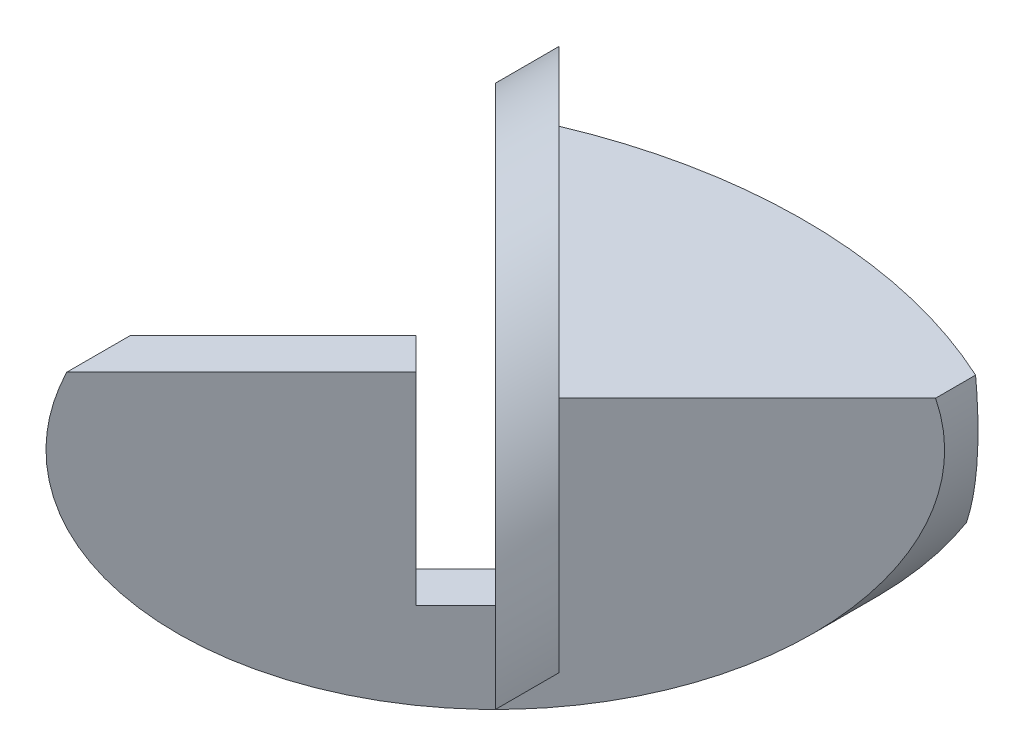
ISO-10303-21;
HEADER;
FILE_DESCRIPTION(('STEP AP214'),'2;1');
FILE_NAME('part.step','',(''),(''),'','','');
FILE_SCHEMA(('AUTOMOTIVE_DESIGN { 1 0 10303 214 1 1 1 1 }'));
ENDSEC;
DATA;
#1=APPLICATION_CONTEXT('core data for automotive mechanical design processes');
#2=APPLICATION_PROTOCOL_DEFINITION('international standard','automotive_design',2000,#1);
#3=PRODUCT_CONTEXT('',#1,'mechanical');
#4=PRODUCT('Part','Part','',(#3));
#5=PRODUCT_RELATED_PRODUCT_CATEGORY('part','',(#4));
#6=PRODUCT_DEFINITION_FORMATION('','',#4);
#7=PRODUCT_DEFINITION_CONTEXT('part definition',#1,'design');
#8=PRODUCT_DEFINITION('design','',#6,#7);
#9=PRODUCT_DEFINITION_SHAPE('','',#8);
#10=(LENGTH_UNIT() NAMED_UNIT(*) SI_UNIT(.MILLI.,.METRE.));
#11=(NAMED_UNIT(*) PLANE_ANGLE_UNIT() SI_UNIT($,.RADIAN.));
#12=(NAMED_UNIT(*) SI_UNIT($,.STERADIAN.) SOLID_ANGLE_UNIT());
#13=UNCERTAINTY_MEASURE_WITH_UNIT(LENGTH_MEASURE(1.E-05),#10,'distance_accuracy_value','');
#14=(GEOMETRIC_REPRESENTATION_CONTEXT(3) GLOBAL_UNCERTAINTY_ASSIGNED_CONTEXT((#13)) GLOBAL_UNIT_ASSIGNED_CONTEXT((#10,
#11,#12)) REPRESENTATION_CONTEXT('',''));
#15=CARTESIAN_POINT('',(0.,0.,0.));
#16=DIRECTION('',(0.,0.,1.));
#17=DIRECTION('',(1.,0.,0.));
#18=AXIS2_PLACEMENT_3D('',#15,#16,#17);
#19=CARTESIAN_POINT('',(0.,0.,-30.));
#20=DIRECTION('',(0.,0.,1.));
#21=DIRECTION('',(1.,0.,0.));
#22=AXIS2_PLACEMENT_3D('',#19,#20,#21);
#23=CYLINDRICAL_SURFACE('',#22,10.);
#24=CARTESIAN_POINT('',(0.,0.,20.));
#25=DIRECTION('',(0.707106781186548,0.,0.707106781186547));
#26=DIRECTION('',(-0.707106781186547,0.,0.707106781186548));
#27=AXIS2_PLACEMENT_3D('',#24,#25,#26);
#28=ELLIPSE('',#27,14.142135623731,10.);
#29=CARTESIAN_POINT('',(9.79795897113271,2.,10.2020410288673));
#30=VERTEX_POINT('',#29);
#31=CARTESIAN_POINT('',(-9.53939201416947,3.,29.5393920141695));
#32=VERTEX_POINT('',#31);
#33=EDGE_CURVE('E246',#30,#32,#28,.F.);
#34=ORIENTED_EDGE('',*,*,#33,.T.);
#35=DIRECTION('',(0.,0.,1.));
#36=VECTOR('',#35,1.);
#37=CARTESIAN_POINT('',(-9.53939201416946,3.,-30.));
#38=LINE('',#37,#36);
#39=CARTESIAN_POINT('',(-9.53939201416945,3.,26.7109648894233));
#40=VERTEX_POINT('',#39);
#41=EDGE_CURVE('E358',#32,#40,#38,.F.);
#42=ORIENTED_EDGE('',*,*,#41,.T.);
#43=CARTESIAN_POINT('',(0.,0.,17.1715728752538));
#44=DIRECTION('',(-0.707106781186548,0.,-0.707106781186547));
#45=DIRECTION('',(-0.707106781186547,0.,0.707106781186548));
#46=AXIS2_PLACEMENT_3D('',#43,#44,#45);
#47=ELLIPSE('',#46,14.142135623731,10.);
#48=CARTESIAN_POINT('',(9.07129437883519,-4.20851735086278,8.10027849641862));
#49=VERTEX_POINT('',#48);
#50=EDGE_CURVE('E205',#40,#49,#47,.F.);
#51=ORIENTED_EDGE('',*,*,#50,.T.);
#52=CARTESIAN_POINT('',(10.,0.,8.5158238349454));
#53=CARTESIAN_POINT('',(9.99999800175301,-0.266025354072141,8.51582168958629));
#54=CARTESIAN_POINT('',(9.98936928975257,-0.532136357908073,8.51077626235926));
#55=CARTESIAN_POINT('',(9.9469649866082,-1.0624092490305,8.49076187121341));
#56=CARTESIAN_POINT('',(9.91517608776742,-1.32656980390184,8.47578666245188));
#57=CARTESIAN_POINT('',(9.83071796092059,-1.85142776168274,8.43638576190849));
#58=CARTESIAN_POINT('',(9.77800221665945,-2.11211610322403,8.41193901970258));
#59=CARTESIAN_POINT('',(9.65226419767231,-2.62758294532051,8.35441682618018));
#60=CARTESIAN_POINT('',(9.57924014876021,-2.88236092742353,8.32134062098708));
#61=CARTESIAN_POINT('',(9.41397656332359,-3.38323722524882,8.24778012951351));
#62=CARTESIAN_POINT('',(9.3218220594301,-3.62936849714295,8.20732871887368));
#63=CARTESIAN_POINT('',(9.11891232424727,-4.11268002964802,8.12013040418464));
#64=CARTESIAN_POINT('',(9.00815645785249,-4.3498599842958,8.07338328519215));
#65=CARTESIAN_POINT('',(8.76895345883075,-4.81389268707027,7.97492836381051));
#66=CARTESIAN_POINT('',(8.64051459186702,-5.04075019474,7.92322288254308));
#67=CARTESIAN_POINT('',(8.36672108339952,-5.48321933672634,7.81617571206859));
#68=CARTESIAN_POINT('',(8.22136027797319,-5.69882683147936,7.7608327010846));
#69=CARTESIAN_POINT('',(7.9054770247606,-6.13017807991415,7.64454086773088));
#70=CARTESIAN_POINT('',(7.73397174036989,-6.3451655563157,7.58345446924429));
#71=CARTESIAN_POINT('',(7.37398792710108,-6.76015987598634,7.46039453631311));
#72=CARTESIAN_POINT('',(7.18550871617938,-6.96016611668981,7.39842096630456));
#73=CARTESIAN_POINT('',(6.79250202400875,-7.34421138694537,7.2751522898297));
#74=CARTESIAN_POINT('',(6.58796560486331,-7.52824140194196,7.21385758320882));
#75=CARTESIAN_POINT('',(6.16409689874947,-7.87905887786898,7.09355917228466));
#76=CARTESIAN_POINT('',(5.94476972229872,-8.04585224449014,7.03455468765164));
#77=CARTESIAN_POINT('',(5.48182477873531,-8.36856531286464,6.91763105280157));
#78=CARTESIAN_POINT('',(5.23755055910022,-8.52361058391754,6.85989198652651));
#79=CARTESIAN_POINT('',(4.73560084196886,-8.81237081748321,6.75018130903005));
#80=CARTESIAN_POINT('',(4.47793099384063,-8.94609467669324,6.69820729501869));
#81=CARTESIAN_POINT('',(3.95083435979347,-9.19104717738885,6.60149790024205));
#82=CARTESIAN_POINT('',(3.68140916707286,-9.30227885579024,6.55676154240478));
#83=CARTESIAN_POINT('',(3.13273177566136,-9.50111134957325,6.47584776944042));
#84=CARTESIAN_POINT('',(2.85348031022151,-9.58871392398412,6.43966971722921));
#85=CARTESIAN_POINT('',(2.30281305080948,-9.7351804486313,6.37868758399126));
#86=CARTESIAN_POINT('',(2.03180161237824,-9.79535210801066,6.35337043831634));
#87=CARTESIAN_POINT('',(1.48501717981494,-9.89301972877804,6.31208267887677));
#88=CARTESIAN_POINT('',(1.20924434463822,-9.93051644565084,6.29611175371487));
#89=CARTESIAN_POINT('',(0.655241274564692,-9.98238624050228,6.27397958230846));
#90=CARTESIAN_POINT('',(0.3770119739712,-9.99676775893506,6.26781475540136));
#91=CARTESIAN_POINT('',(-0.179713217552794,-10.0022590474234,6.26546355673444));
#92=CARTESIAN_POINT('',(-0.458209096973166,-9.99336978061667,6.26927677200059));
#93=CARTESIAN_POINT('',(-0.995313183331326,-9.95375008945022,6.28620429960587));
#94=CARTESIAN_POINT('',(-1.25404863323046,-9.92446094255941,6.29870472672065));
#95=CARTESIAN_POINT('',(-1.7679128876688,-9.84591458666863,6.33202289974707));
#96=CARTESIAN_POINT('',(-2.02304187638254,-9.79665840118429,6.35284021933182));
#97=CARTESIAN_POINT('',(-2.52798236384529,-9.67866389063359,6.40227647957531));
#98=CARTESIAN_POINT('',(-2.77779367954475,-9.60992489607524,6.43089568833077));
#99=CARTESIAN_POINT('',(-3.27050593627783,-9.45360236824787,6.49524222524732));
#100=CARTESIAN_POINT('',(-3.51340666541398,-9.36601825783969,6.53096977110155));
#101=CARTESIAN_POINT('',(-3.99445113422298,-9.17129779360903,6.60927671541224));
#102=CARTESIAN_POINT('',(-4.2324680736769,-9.06388675046188,6.65195123273174));
#103=CARTESIAN_POINT('',(-4.69863305324245,-8.83123640288936,6.74276595525875));
#104=CARTESIAN_POINT('',(-4.92677752077946,-8.70599071379339,6.79090811658737));
#105=CARTESIAN_POINT('',(-5.37194106863241,-8.43858263814462,6.89154403531096));
#106=CARTESIAN_POINT('',(-5.58895907778036,-8.29641862718799,6.94403821041523));
#107=CARTESIAN_POINT('',(-6.01079402299344,-7.99608664370766,7.05219230229872));
#108=CARTESIAN_POINT('',(-6.2156102253228,-7.83791771029422,7.10785240906345));
#109=CARTESIAN_POINT('',(-6.62672715850625,-7.4942293814433,7.22528096696796));
#110=CARTESIAN_POINT('',(-6.83201937860553,-7.30755262576155,7.28719687727249));
#111=CARTESIAN_POINT('',(-7.2263066027181,-6.9178988821332,7.4116470820431));
#112=CARTESIAN_POINT('',(-7.41530092564483,-6.7149212136579,7.47418140223081));
#113=CARTESIAN_POINT('',(-7.7759943476518,-6.2937123784709,7.59824359827956));
#114=CARTESIAN_POINT('',(-7.94768713078581,-6.07547569032763,7.65977109978426));
#115=CARTESIAN_POINT('',(-8.27266878657132,-5.62495395629636,7.78012358533969));
#116=CARTESIAN_POINT('',(-8.42595537348783,-5.39266717100128,7.83894823318337));
#117=CARTESIAN_POINT('',(-8.71831582155043,-4.90655943919479,7.95427691502637));
#118=CARTESIAN_POINT('',(-8.85666268384631,-4.65226124231374,8.01061683065033));
#119=CARTESIAN_POINT('',(-9.11118691466151,-4.13160925009524,8.11669647890511));
#120=CARTESIAN_POINT('',(-9.22737399375343,-3.86526079886246,8.16643909959259));
#121=CARTESIAN_POINT('',(-9.43646734954068,-3.32229972824101,8.25758698024257));
#122=CARTESIAN_POINT('',(-9.5293826382253,-3.04569112987965,8.29899546637057));
#123=CARTESIAN_POINT('',(-9.69092641715653,-2.48420216203851,8.37193512683786));
#124=CARTESIAN_POINT('',(-9.75955721894504,-2.19932258263457,8.40346724123614));
#125=CARTESIAN_POINT('',(-9.8678839968796,-1.64306476750629,8.45364667918114));
#126=CARTESIAN_POINT('',(-9.90921817018359,-1.37207038122974,8.47301909091621));
#127=CARTESIAN_POINT('',(-9.96950944495245,-0.827063176435964,8.50137616184885));
#128=CARTESIAN_POINT('',(-9.98846756677054,-0.553050496128816,8.5103612947084));
#129=CARTESIAN_POINT('',(-10.0037637112747,-0.00434391610607671,8.51760600632515));
#130=CARTESIAN_POINT('',(-10.0001091668875,0.27034973009694,8.5158691094819));
#131=CARTESIAN_POINT('',(-9.970243982151,0.818225073542503,8.50174301070528));
#132=CARTESIAN_POINT('',(-9.94403409864764,1.09140682120735,8.48935416619871));
#133=CARTESIAN_POINT('',(-9.87199369145689,1.61514142475924,8.45560726773565));
#134=CARTESIAN_POINT('',(-9.82765578011641,1.86594588172181,8.43493350770351));
#135=CARTESIAN_POINT('',(-9.72018466246586,2.36275770663048,8.38540721253467));
#136=CARTESIAN_POINT('',(-9.65704500979981,2.60876339840072,8.35655187242791));
#137=CARTESIAN_POINT('',(-9.51258786730279,3.09432132454258,8.29153357236211));
#138=CARTESIAN_POINT('',(-9.43127394698332,3.33387481581849,8.25537204750581));
#139=CARTESIAN_POINT('',(-9.25111920387502,3.80532585171438,8.17674595147711));
#140=CARTESIAN_POINT('',(-9.15227151383103,4.03722035425818,8.13427891176005));
#141=CARTESIAN_POINT('',(-8.933198395502,4.50186010776454,8.042244141312));
#142=CARTESIAN_POINT('',(-8.81223638389766,4.73421300492039,7.99244957297845));
#143=CARTESIAN_POINT('',(-8.55288970859376,5.18810506149358,7.88857888570132));
#144=CARTESIAN_POINT('',(-8.41449740055821,5.40963941674554,7.83450089207831));
#145=CARTESIAN_POINT('',(-8.12117554247545,5.84076147934641,7.72346180376126));
#146=CARTESIAN_POINT('',(-7.9662432768036,6.05034721621071,7.66650023643537));
#147=CARTESIAN_POINT('',(-7.64072295504028,6.45655507967204,7.55109230520155));
#148=CARTESIAN_POINT('',(-7.47013415697383,6.653176591125,7.49264587101966));
#149=CARTESIAN_POINT('',(-7.09863738788956,7.04906442602281,7.37053764525186));
#150=CARTESIAN_POINT('',(-6.89638271493956,7.24706629983482,7.30686549163384));
#151=CARTESIAN_POINT('',(-6.47561816191736,7.62537776818717,7.18113728904564));
#152=CARTESIAN_POINT('',(-6.25711371725495,7.80569323229815,7.11908070897335));
#153=CARTESIAN_POINT('',(-5.80488728669915,8.14761776570167,6.9981892707661));
#154=CARTESIAN_POINT('',(-5.57115726624853,8.30921683131699,6.93935614429713));
#155=CARTESIAN_POINT('',(-5.0900405730598,8.6123333532922,6.82655878794104));
#156=CARTESIAN_POINT('',(-4.84265987923253,8.75385950599784,6.77259245328847));
#157=CARTESIAN_POINT('',(-4.33436698157967,9.0164016083047,6.67072015665276));
#158=CARTESIAN_POINT('',(-4.07339176717204,9.13730840775212,6.62284676733451));
#159=CARTESIAN_POINT('',(-3.54084964775806,9.35656429849877,6.53485216886225));
#160=CARTESIAN_POINT('',(-3.26928259728941,9.45491307987115,6.49473106621887));
#161=CARTESIAN_POINT('',(-2.71771473202306,9.62795523256357,6.42344218210631));
#162=CARTESIAN_POINT('',(-2.43771837710516,9.70266088050997,6.39226975484829));
#163=CARTESIAN_POINT('',(-1.87141550219704,9.82760704425789,6.3397994951122));
#164=CARTESIAN_POINT('',(-1.58510949094729,9.87784952500808,6.31850086954989));
#165=CARTESIAN_POINT('',(-1.0297341692126,9.95048985813206,6.2876099320675));
#166=CARTESIAN_POINT('',(-0.760936048639142,9.97465574575951,6.27727525202685));
#167=CARTESIAN_POINT('',(-0.222075071348638,10.0011718751192,6.26593213024286));
#168=CARTESIAN_POINT('',(0.0479877195577139,10.0035232396832,6.26492320848639));
#169=CARTESIAN_POINT('',(0.58724132192027,9.98638631653396,6.27225833824804));
#170=CARTESIAN_POINT('',(0.856432275949513,9.96690180149303,6.28060077409471));
#171=CARTESIAN_POINT('',(1.39192451373787,9.90631866591764,6.3064086597026));
#172=CARTESIAN_POINT('',(1.65822582148058,9.86522022491547,6.32387403368573));
#173=CARTESIAN_POINT('',(2.17557908765371,9.76389210176625,6.36659951388901));
#174=CARTESIAN_POINT('',(2.42681905438236,9.70447771976957,6.39152632587636));
#175=CARTESIAN_POINT('',(2.92326198071166,9.56665698804329,6.4487688565194));
#176=CARTESIAN_POINT('',(3.16846279865358,9.48824400471917,6.48108715578207));
#177=CARTESIAN_POINT('',(3.65118369665827,9.31315013736545,6.55233441039793));
#178=CARTESIAN_POINT('',(3.88870561564902,9.2164736655657,6.59126176885569));
#179=CARTESIAN_POINT('',(4.35488161168696,9.00558081902348,6.67485293087774));
#180=CARTESIAN_POINT('',(4.58353226716738,8.89135775932092,6.71951891969957));
#181=CARTESIAN_POINT('',(5.04080616794785,8.6406769979228,6.81570701609836));
#182=CARTESIAN_POINT('',(5.2689600586381,8.50344709325272,6.86744789819654));
#183=CARTESIAN_POINT('',(5.71304307147576,8.2116839939819,6.97487639679231));
#184=CARTESIAN_POINT('',(5.92896794744427,8.05714484402619,7.03056536922156));
#185=CARTESIAN_POINT('',(6.34746480533821,7.73174995165879,7.14457381718175));
#186=CARTESIAN_POINT('',(6.55003462781847,7.56089158139482,7.20289371556502));
#187=CARTESIAN_POINT('',(6.94079675503273,7.20384575457631,7.32078892941435));
#188=CARTESIAN_POINT('',(7.12898832918574,7.01765752008507,7.38036430847736));
#189=CARTESIAN_POINT('',(7.50319549480205,6.61684160032944,7.50368891970136));
#190=CARTESIAN_POINT('',(7.68805633537102,6.40113033819157,7.56742642749068));
#191=CARTESIAN_POINT('',(8.03895416777263,5.95448136827142,7.69291029308265));
#192=CARTESIAN_POINT('',(8.20499723127669,5.7235486100533,7.75465728850868));
#193=CARTESIAN_POINT('',(8.51737047976831,5.24743212143809,7.87443702533053));
#194=CARTESIAN_POINT('',(8.66368015929906,5.00223394033954,7.93246587074155));
#195=CARTESIAN_POINT('',(8.93518614780879,4.49933986233196,8.04291029928862));
#196=CARTESIAN_POINT('',(9.06039203647734,4.2416497047047,8.09532842534556));
#197=CARTESIAN_POINT('',(9.28849235553639,3.71563888714507,8.19277529909402));
#198=CARTESIAN_POINT('',(9.39141670175772,3.44733306017035,8.23781393468212));
#199=CARTESIAN_POINT('',(9.57405568202941,2.90175012543665,8.31896797772764));
#200=CARTESIAN_POINT('',(9.65378179799251,2.62447753152824,8.35508779818804));
#201=CARTESIAN_POINT('',(9.78897119729235,2.06373710583795,8.41698263572561));
#202=CARTESIAN_POINT('',(9.84449838708616,1.78028769319899,8.44278488520814));
#203=CARTESIAN_POINT('',(9.9308427864624,1.20900680594721,8.48313749800603));
#204=CARTESIAN_POINT('',(9.96167894039422,0.921178863911138,8.49769648747645));
#205=CARTESIAN_POINT('',(9.98664906516558,0.527241387217216,8.50950190073325));
#206=CARTESIAN_POINT('',(9.99165400876779,0.421874883748588,8.51187077403092));
#207=CARTESIAN_POINT('',(9.99832989876416,0.21101007940495,8.51503217902304));
#208=CARTESIAN_POINT('',(10.0000007925507,0.105511776476573,8.51582468584419));
#209=CARTESIAN_POINT('',(10.,0.,8.5158238349454));
#210=B_SPLINE_CURVE_WITH_KNOTS('',3,(#52,#53,#54,#55,#56,#57,#58,#59,#60,#61,#62,#63,#64,#65,
#66,#67,#68,#69,#70,#71,#72,#73,#74,#75,#76,#77,#78,#79,#80,#81,#82,#83,#84,#85,#86,#87,#88,#89,
#90,#91,#92,#93,#94,#95,#96,#97,#98,#99,#100,#101,#102,#103,#104,#105,#106,#107,#108,#109,#110,
#111,#112,#113,#114,#115,#116,#117,#118,#119,#120,#121,#122,#123,#124,#125,#126,#127,#128,#129,
#130,#131,#132,#133,#134,#135,#136,#137,#138,#139,#140,#141,#142,#143,#144,#145,#146,#147,#148,
#149,#150,#151,#152,#153,#154,#155,#156,#157,#158,#159,#160,#161,#162,#163,#164,#165,#166,#167,
#168,#169,#170,#171,#172,#173,#174,#175,#176,#177,#178,#179,#180,#181,#182,#183,#184,#185,#186,
#187,#188,#189,#190,#191,#192,#193,#194,#195,#196,#197,#198,#199,#200,#201,#202,#203,#204,#205,
#206,#207,#208,#209),.UNSPECIFIED.,.T.,.F.,(4,2,2,2,2,2,2,2,2,2,2,2,2,2,2,2,2,2,2,2,2,2,2,2,2,2,
2,2,2,2,2,2,2,2,2,2,2,2,2,2,2,2,2,2,2,2,2,2,2,2,2,2,2,2,2,2,2,2,2,2,2,2,2,2,2,2,2,2,2,2,2,2,2,2,
2,2,2,2,4),(0.,0.797966391908417,1.59643510170749,2.3966886783057,3.19701218910311,
3.99385173404986,4.79071849098459,5.58721402077733,6.38400059227758,7.22822967907794,
8.07249270370491,8.91722904723821,9.76167499742739,10.6456482131649,11.5292516062747,
12.412735614628,13.2961538353247,14.1313495132909,14.9665173626361,15.8013801832912,
16.636208450955,17.4173522321574,18.198455976787,18.9795865659086,19.7607410808706,
20.5536642595291,21.346872015778,22.1401559929941,22.933487624999,23.7854374556098,
24.6374228718346,25.4897181880752,26.3421192356071,27.2257676295207,28.1090279083228,
28.9919456143272,29.8747792563507,30.6981205326488,31.52142426294,32.3444573824574,
33.1674628861225,33.9331854057135,34.6991707634326,35.4650058100253,36.2311414676107,
37.0302275008457,37.8296652144136,38.6292343866832,39.4288414707282,40.2981742602835,
41.1672175621256,42.0367232337043,42.9058510442478,43.7794457224546,44.653052402347,
45.5262047175014,46.3992868870932,47.2085012083547,48.0176738777038,48.8267067646,
49.6357329315124,50.4129655914008,51.1904700236776,51.967786860285,52.7454005796125,
53.5581989850295,54.3712779028984,55.18448797073,55.9977393315778,56.8701666271729,
57.7423116224578,58.6153560158745,59.488003032787,60.3594710409664,61.2305069814149,
62.0992284716126,62.9672827894968,63.283769627389,63.6002614590511),.UNSPECIFIED.);
#211=CARTESIAN_POINT('',(9.79795897113272,2.,8.42126477061956));
#212=VERTEX_POINT('',#211);
#213=EDGE_CURVE('E298',#212,#49,#210,.T.);
#214=ORIENTED_EDGE('',*,*,#213,.F.);
#215=DIRECTION('',(0.,0.,1.));
#216=VECTOR('',#215,1.);
#217=CARTESIAN_POINT('',(9.79795897113272,2.,-30.));
#218=LINE('',#217,#216);
#219=EDGE_CURVE('E301',#30,#212,#218,.F.);
#220=ORIENTED_EDGE('',*,*,#219,.F.);
#221=EDGE_LOOP('',(#34,#42,#51,#214,#220));
#222=FACE_BOUND('',#221,.T.);
#223=ADVANCED_FACE('F97',(#222),#23,.T.);
#224=CARTESIAN_POINT('',(11.1651513899117,0.,6.00642148534213));
#225=DIRECTION('',(-0.707106781186548,0.,-0.707106781186547));
#226=DIRECTION('',(-0.707106781186547,0.,0.707106781186548));
#227=AXIS2_PLACEMENT_3D('',#224,#225,#226);
#228=PLANE('',#227);
#229=ORIENTED_EDGE('',*,*,#50,.F.);
#230=DIRECTION('',(-0.707106781186547,0.,0.707106781186548));
#231=VECTOR('',#230,1.);
#232=CARTESIAN_POINT('',(-3.18198051533946,3.,20.3535533905933));
#233=LINE('',#232,#231);
#234=CARTESIAN_POINT('',(-3.18198051533946,3.,20.3535533905933));
#235=VERTEX_POINT('',#234);
#236=EDGE_CURVE('E192',#235,#40,#233,.T.);
#237=ORIENTED_EDGE('',*,*,#236,.F.);
#238=DIRECTION('',(0.,1.,0.));
#239=VECTOR('',#238,1.);
#240=CARTESIAN_POINT('',(-3.18198051533946,0.,20.3535533905933));
#241=LINE('',#240,#239);
#242=CARTESIAN_POINT('',(-3.18198051533946,-6.,20.3535533905933));
#243=VERTEX_POINT('',#242);
#244=EDGE_CURVE('E203',#243,#235,#241,.T.);
#245=ORIENTED_EDGE('',*,*,#244,.F.);
#246=DIRECTION('',(-0.707106781186547,0.,0.707106781186548));
#247=VECTOR('',#246,1.);
#248=CARTESIAN_POINT('',(11.1651513899117,-6.,6.00642148534213));
#249=LINE('',#248,#247);
#250=CARTESIAN_POINT('',(-1.41421356237309,-6.,18.5857864376269));
#251=VERTEX_POINT('',#250);
#252=EDGE_CURVE('E212',#251,#243,#249,.T.);
#253=ORIENTED_EDGE('',*,*,#252,.F.);
#254=DIRECTION('',(0.,-1.,0.));
#255=VECTOR('',#254,1.);
#256=CARTESIAN_POINT('',(-1.41421356237309,0.,18.5857864376269));
#257=LINE('',#256,#255);
#258=CARTESIAN_POINT('',(-1.41421356237309,0.,18.5857864376269));
#259=VERTEX_POINT('',#258);
#260=EDGE_CURVE('E214',#259,#251,#257,.T.);
#261=ORIENTED_EDGE('',*,*,#260,.F.);
#262=DIRECTION('',(0.707106781186547,0.,-0.707106781186548));
#263=VECTOR('',#262,1.);
#264=CARTESIAN_POINT('',(11.1651513899117,0.,6.00642148534213));
#265=LINE('',#264,#263);
#266=CARTESIAN_POINT('',(9.07129437883519,0.,8.10027849641862));
#267=VERTEX_POINT('',#266);
#268=EDGE_CURVE('E249',#259,#267,#265,.T.);
#269=ORIENTED_EDGE('',*,*,#268,.T.);
#270=DIRECTION('',(0.,1.,0.));
#271=VECTOR('',#270,1.);
#272=CARTESIAN_POINT('',(9.07129437883519,0.,8.10027849641862));
#273=LINE('',#272,#271);
#274=EDGE_CURVE('E52',#49,#267,#273,.T.);
#275=ORIENTED_EDGE('',*,*,#274,.F.);
#276=EDGE_LOOP('',(#229,#237,#245,#253,#261,#269,#275));
#277=FACE_BOUND('',#276,.T.);
#278=ADVANCED_FACE('F201',(#277),#228,.T.);
#279=CARTESIAN_POINT('',(-9.99999999999998,0.,30.));
#280=DIRECTION('',(0.707106781186548,0.,0.707106781186547));
#281=DIRECTION('',(0.707106781186547,0.,-0.707106781186548));
#282=AXIS2_PLACEMENT_3D('',#279,#280,#281);
#283=PLANE('',#282);
#284=DIRECTION('',(0.,1.,0.));
#285=VECTOR('',#284,1.);
#286=CARTESIAN_POINT('',(-1.76776695296637,-6.,21.7677669529664));
#287=LINE('',#286,#285);
#288=CARTESIAN_POINT('',(-1.76776695296636,-6.,21.7677669529664));
#289=VERTEX_POINT('',#288);
#290=CARTESIAN_POINT('',(-1.76776695296637,3.,21.7677669529664));
#291=VERTEX_POINT('',#290);
#292=EDGE_CURVE('E216',#289,#291,#287,.T.);
#293=ORIENTED_EDGE('',*,*,#292,.T.);
#294=DIRECTION('',(0.707106781186548,0.,-0.707106781186547));
#295=VECTOR('',#294,1.);
#296=CARTESIAN_POINT('',(-11.1651513899117,3.,31.1651513899117));
#297=LINE('',#296,#295);
#298=EDGE_CURVE('E112',#32,#291,#297,.T.);
#299=ORIENTED_EDGE('',*,*,#298,.F.);
#300=ORIENTED_EDGE('',*,*,#33,.F.);
#301=DIRECTION('',(-0.707106781186547,0.,0.707106781186548));
#302=VECTOR('',#301,1.);
#303=CARTESIAN_POINT('',(11.8997215035814,2.,8.10027849641862));
#304=LINE('',#303,#302);
#305=CARTESIAN_POINT('',(1.4142135623731,2.,18.5857864376269));
#306=VERTEX_POINT('',#305);
#307=EDGE_CURVE('E286',#30,#306,#304,.T.);
#308=ORIENTED_EDGE('',*,*,#307,.T.);
#309=DIRECTION('',(0.,1.,0.));
#310=VECTOR('',#309,1.);
#311=CARTESIAN_POINT('',(1.4142135623731,14.,18.5857864376269));
#312=LINE('',#311,#310);
#313=CARTESIAN_POINT('',(1.4142135623731,6.5,18.5857864376269));
#314=VERTEX_POINT('',#313);
#315=EDGE_CURVE('E233',#306,#314,#312,.T.);
#316=ORIENTED_EDGE('',*,*,#315,.T.);
#317=DIRECTION('',(0.707106781186548,0.,-0.707106781186548));
#318=VECTOR('',#317,1.);
#319=CARTESIAN_POINT('',(12.0480520456847,6.5,7.95194795431526));
#320=LINE('',#319,#318);
#321=CARTESIAN_POINT('',(0.,6.5,20.));
#322=VERTEX_POINT('',#321);
#323=EDGE_CURVE('E227',#322,#314,#320,.T.);
#324=ORIENTED_EDGE('',*,*,#323,.F.);
#325=DIRECTION('',(0.,-1.,0.));
#326=VECTOR('',#325,1.);
#327=CARTESIAN_POINT('',(0.,14.,20.));
#328=LINE('',#327,#326);
#329=CARTESIAN_POINT('',(0.,-6.,20.));
#330=VERTEX_POINT('',#329);
#331=EDGE_CURVE('E235',#322,#330,#328,.T.);
#332=ORIENTED_EDGE('',*,*,#331,.T.);
#333=DIRECTION('',(0.707106781186547,0.,-0.707106781186548));
#334=VECTOR('',#333,1.);
#335=CARTESIAN_POINT('',(-1.76776695296637,-6.,21.7677669529664));
#336=LINE('',#335,#334);
#337=EDGE_CURVE('E363',#289,#330,#336,.T.);
#338=ORIENTED_EDGE('',*,*,#337,.F.);
#339=EDGE_LOOP('',(#293,#299,#300,#308,#316,#324,#332,#338));
#340=FACE_BOUND('',#339,.T.);
#341=ADVANCED_FACE('F282',(#340),#283,.T.);
#342=CARTESIAN_POINT('',(-1.76776695296637,-6.,21.7677669529664));
#343=DIRECTION('',(-0.707106781186547,0.,0.707106781186548));
#344=DIRECTION('',(0.707106781186548,0.,0.707106781186547));
#345=AXIS2_PLACEMENT_3D('',#342,#343,#344);
#346=PLANE('',#345);
#347=DIRECTION('',(-0.707106781186548,0.,-0.707106781186547));
#348=VECTOR('',#347,1.);
#349=CARTESIAN_POINT('',(-1.76776695296637,3.,21.7677669529664));
#350=LINE('',#349,#348);
#351=EDGE_CURVE('E189',#291,#235,#350,.T.);
#352=ORIENTED_EDGE('',*,*,#351,.F.);
#353=ORIENTED_EDGE('',*,*,#292,.F.);
#354=DIRECTION('',(0.707106781186548,0.,0.707106781186547));
#355=VECTOR('',#354,1.);
#356=CARTESIAN_POINT('',(-1.76776695296637,-6.,21.7677669529664));
#357=LINE('',#356,#355);
#358=EDGE_CURVE('E210',#243,#289,#357,.T.);
#359=ORIENTED_EDGE('',*,*,#358,.F.);
#360=ORIENTED_EDGE('',*,*,#244,.T.);
#361=EDGE_LOOP('',(#352,#353,#359,#360));
#362=FACE_BOUND('',#361,.T.);
#363=ADVANCED_FACE('F208',(#362),#346,.F.);
#364=CARTESIAN_POINT('',(0.,0.,29.6193458072075));
#365=DIRECTION('',(0.,1.,0.));
#366=DIRECTION('',(0.,0.,1.));
#367=AXIS2_PLACEMENT_3D('',#364,#365,#366);
#368=CYLINDRICAL_SURFACE('',#367,23.3529150136284);
#369=CARTESIAN_POINT('',(0.,2.,29.6193458072075));
#370=DIRECTION('',(0.,1.,0.));
#371=DIRECTION('',(0.,0.,1.));
#372=AXIS2_PLACEMENT_3D('',#369,#370,#371);
#373=CIRCLE('',#372,23.3529150136284);
#374=CARTESIAN_POINT('',(-9.07129437883518,2.,8.10027849641862));
#375=VERTEX_POINT('',#374);
#376=EDGE_CURVE('E295',#212,#375,#373,.T.);
#377=ORIENTED_EDGE('',*,*,#376,.F.);
#378=ORIENTED_EDGE('',*,*,#213,.T.);
#379=ORIENTED_EDGE('',*,*,#274,.T.);
#380=CARTESIAN_POINT('',(0.,0.,29.6193458072075));
#381=DIRECTION('',(0.,-1.,0.));
#382=DIRECTION('',(0.,0.,-1.));
#383=AXIS2_PLACEMENT_3D('',#380,#381,#382);
#384=CIRCLE('',#383,23.3529150136284);
#385=CARTESIAN_POINT('',(-10.,0.,8.5158238349454));
#386=VERTEX_POINT('',#385);
#387=EDGE_CURVE('E310',#267,#386,#384,.F.);
#388=ORIENTED_EDGE('',*,*,#387,.T.);
#389=CARTESIAN_POINT('',(-9.07129437883519,4.2085173508628,8.10027849641862));
#390=VERTEX_POINT('',#389);
#391=EDGE_CURVE('E120',#386,#390,#210,.T.);
#392=ORIENTED_EDGE('',*,*,#391,.T.);
#393=DIRECTION('',(0.,1.,0.));
#394=VECTOR('',#393,1.);
#395=CARTESIAN_POINT('',(-9.07129437883519,0.,8.10027849641862));
#396=LINE('',#395,#394);
#397=EDGE_CURVE('E356',#390,#375,#396,.F.);
#398=ORIENTED_EDGE('',*,*,#397,.T.);
#399=EDGE_LOOP('',(#377,#378,#379,#388,#392,#398));
#400=FACE_BOUND('',#399,.T.);
#401=ADVANCED_FACE('F312',(#400),#368,.T.);
#402=DIRECTION('',(0.,0.,1.));
#403=VECTOR('',#402,1.);
#404=CARTESIAN_POINT('',(-10.,0.,-30.));
#405=LINE('',#404,#403);
#406=CARTESIAN_POINT('',(-9.99999999999999,0.,10.));
#407=VERTEX_POINT('',#406);
#408=EDGE_CURVE('E296',#407,#386,#405,.F.);
#409=ORIENTED_EDGE('',*,*,#408,.F.);
#410=CARTESIAN_POINT('',(0.,0.,20.));
#411=DIRECTION('',(-0.707106781186547,0.,0.707106781186548));
#412=DIRECTION('',(0.707106781186548,0.,0.707106781186547));
#413=AXIS2_PLACEMENT_3D('',#410,#411,#412);
#414=ELLIPSE('',#413,14.142135623731,10.);
#415=CARTESIAN_POINT('',(10.,0.,30.));
#416=VERTEX_POINT('',#415);
#417=EDGE_CURVE('E251',#407,#416,#414,.F.);
#418=ORIENTED_EDGE('',*,*,#417,.T.);
#419=DIRECTION('',(0.,0.,1.));
#420=VECTOR('',#419,1.);
#421=CARTESIAN_POINT('',(10.,0.,-30.));
#422=LINE('',#421,#420);
#423=CARTESIAN_POINT('',(10.,0.,27.1715728752538));
#424=VERTEX_POINT('',#423);
#425=EDGE_CURVE('E243',#416,#424,#422,.F.);
#426=ORIENTED_EDGE('',*,*,#425,.T.);
#427=CARTESIAN_POINT('',(0.,0.,17.1715728752538));
#428=DIRECTION('',(0.707106781186547,0.,-0.707106781186548));
#429=DIRECTION('',(0.707106781186548,0.,0.707106781186547));
#430=AXIS2_PLACEMENT_3D('',#427,#428,#429);
#431=ELLIPSE('',#430,14.142135623731,10.);
#432=EDGE_CURVE('E253',#424,#390,#431,.F.);
#433=ORIENTED_EDGE('',*,*,#432,.T.);
#434=ORIENTED_EDGE('',*,*,#391,.F.);
#435=EDGE_LOOP('',(#409,#418,#426,#433,#434));
#436=FACE_BOUND('',#435,.T.);
#437=ADVANCED_FACE('F317',(#436),#23,.T.);
#438=CARTESIAN_POINT('',(0.,0.,0.));
#439=DIRECTION('',(0.,-1.,0.));
#440=DIRECTION('',(0.,0.,-1.));
#441=AXIS2_PLACEMENT_3D('',#438,#439,#440);
#442=PLANE('',#441);
#443=ORIENTED_EDGE('',*,*,#387,.F.);
#444=ORIENTED_EDGE('',*,*,#268,.F.);
#445=DIRECTION('',(0.707106781186547,0.,0.707106781186548));
#446=VECTOR('',#445,1.);
#447=CARTESIAN_POINT('',(-10.,0.,10.));
#448=LINE('',#447,#446);
#449=EDGE_CURVE('E211',#407,#259,#448,.T.);
#450=ORIENTED_EDGE('',*,*,#449,.F.);
#451=ORIENTED_EDGE('',*,*,#408,.T.);
#452=EDGE_LOOP('',(#443,#444,#450,#451));
#453=FACE_BOUND('',#452,.T.);
#454=ADVANCED_FACE('F333',(#453),#442,.T.);
#455=CARTESIAN_POINT('',(10.,14.,30.));
#456=DIRECTION('',(-0.707106781186547,0.,0.707106781186548));
#457=DIRECTION('',(0.707106781186548,0.,0.707106781186547));
#458=AXIS2_PLACEMENT_3D('',#455,#456,#457);
#459=PLANE('',#458);
#460=ORIENTED_EDGE('',*,*,#417,.F.);
#461=ORIENTED_EDGE('',*,*,#449,.T.);
#462=ORIENTED_EDGE('',*,*,#260,.T.);
#463=DIRECTION('',(-0.707106781186547,0.,-0.707106781186548));
#464=VECTOR('',#463,1.);
#465=CARTESIAN_POINT('',(0.,-6.,20.));
#466=LINE('',#465,#464);
#467=EDGE_CURVE('E367',#330,#251,#466,.T.);
#468=ORIENTED_EDGE('',*,*,#467,.F.);
#469=ORIENTED_EDGE('',*,*,#331,.F.);
#470=DIRECTION('',(-0.707106781186548,0.,-0.707106781186547));
#471=VECTOR('',#470,1.);
#472=CARTESIAN_POINT('',(10.,6.5,30.));
#473=LINE('',#472,#471);
#474=CARTESIAN_POINT('',(2.12132034355964,6.5,22.1213203435596));
#475=VERTEX_POINT('',#474);
#476=EDGE_CURVE('E241',#475,#322,#473,.T.);
#477=ORIENTED_EDGE('',*,*,#476,.F.);
#478=DIRECTION('',(0.,1.,0.));
#479=VECTOR('',#478,1.);
#480=CARTESIAN_POINT('',(2.12132034355964,14.,22.1213203435596));
#481=LINE('',#480,#479);
#482=CARTESIAN_POINT('',(2.12132034355964,0.,22.1213203435596));
#483=VERTEX_POINT('',#482);
#484=EDGE_CURVE('E239',#483,#475,#481,.T.);
#485=ORIENTED_EDGE('',*,*,#484,.F.);
#486=DIRECTION('',(-0.707106781186547,0.,-0.707106781186548));
#487=VECTOR('',#486,1.);
#488=CARTESIAN_POINT('',(12.,0.,32.));
#489=LINE('',#488,#487);
#490=EDGE_CURVE('E224',#416,#483,#489,.T.);
#491=ORIENTED_EDGE('',*,*,#490,.F.);
#492=EDGE_LOOP('',(#460,#461,#462,#468,#469,#477,#485,#491));
#493=FACE_BOUND('',#492,.T.);
#494=ADVANCED_FACE('F278',(#493),#459,.T.);
#495=CARTESIAN_POINT('',(11.4142135623731,14.,28.5857864376269));
#496=DIRECTION('',(0.707106781186547,0.,-0.707106781186548));
#497=DIRECTION('',(-0.707106781186548,0.,-0.707106781186547));
#498=AXIS2_PLACEMENT_3D('',#495,#496,#497);
#499=PLANE('',#498);
#500=ORIENTED_EDGE('',*,*,#315,.F.);
#501=DIRECTION('',(0.707106781186547,0.,0.707106781186547));
#502=VECTOR('',#501,1.);
#503=CARTESIAN_POINT('',(-9.07129437883519,2.,8.10027849641862));
#504=LINE('',#503,#502);
#505=EDGE_CURVE('E289',#375,#306,#504,.T.);
#506=ORIENTED_EDGE('',*,*,#505,.F.);
#507=ORIENTED_EDGE('',*,*,#397,.F.);
#508=ORIENTED_EDGE('',*,*,#432,.F.);
#509=DIRECTION('',(-0.707106781186547,0.,-0.707106781186548));
#510=VECTOR('',#509,1.);
#511=CARTESIAN_POINT('',(-8.5857864376269,0.,8.5857864376269));
#512=LINE('',#511,#510);
#513=CARTESIAN_POINT('',(3.53553390593274,0.,20.7071067811865));
#514=VERTEX_POINT('',#513);
#515=EDGE_CURVE('E221',#424,#514,#512,.T.);
#516=ORIENTED_EDGE('',*,*,#515,.T.);
#517=DIRECTION('',(0.,-1.,0.));
#518=VECTOR('',#517,1.);
#519=CARTESIAN_POINT('',(3.53553390593274,14.,20.7071067811865));
#520=LINE('',#519,#518);
#521=CARTESIAN_POINT('',(3.53553390593274,6.5,20.7071067811865));
#522=VERTEX_POINT('',#521);
#523=EDGE_CURVE('E237',#522,#514,#520,.T.);
#524=ORIENTED_EDGE('',*,*,#523,.F.);
#525=DIRECTION('',(0.707106781186548,0.,0.707106781186547));
#526=VECTOR('',#525,1.);
#527=CARTESIAN_POINT('',(11.4142135623731,6.5,28.5857864376269));
#528=LINE('',#527,#526);
#529=EDGE_CURVE('E105',#314,#522,#528,.T.);
#530=ORIENTED_EDGE('',*,*,#529,.F.);
#531=EDGE_LOOP('',(#500,#506,#507,#508,#516,#524,#530));
#532=FACE_BOUND('',#531,.T.);
#533=ADVANCED_FACE('F269',(#532),#499,.T.);
#534=CARTESIAN_POINT('',(0.,0.,0.));
#535=DIRECTION('',(0.,-1.,0.));
#536=DIRECTION('',(0.,0.,-1.));
#537=AXIS2_PLACEMENT_3D('',#534,#535,#536);
#538=PLANE('',#537);
#539=ORIENTED_EDGE('',*,*,#515,.F.);
#540=ORIENTED_EDGE('',*,*,#425,.F.);
#541=ORIENTED_EDGE('',*,*,#490,.T.);
#542=DIRECTION('',(-0.707106781186548,0.,0.707106781186548));
#543=VECTOR('',#542,1.);
#544=CARTESIAN_POINT('',(12.1213203435596,0.,12.1213203435596));
#545=LINE('',#544,#543);
#546=EDGE_CURVE('E257',#514,#483,#545,.T.);
#547=ORIENTED_EDGE('',*,*,#546,.F.);
#548=EDGE_LOOP('',(#539,#540,#541,#547));
#549=FACE_BOUND('',#548,.T.);
#550=ADVANCED_FACE('F274',(#549),#538,.T.);
#551=CARTESIAN_POINT('',(14.1693723892444,6.5,10.0732682978749));
#552=DIRECTION('',(0.707106781186548,0.,0.707106781186548));
#553=DIRECTION('',(0.707106781186548,0.,-0.707106781186548));
#554=AXIS2_PLACEMENT_3D('',#551,#552,#553);
#555=PLANE('',#554);
#556=ORIENTED_EDGE('',*,*,#523,.T.);
#557=ORIENTED_EDGE('',*,*,#546,.T.);
#558=ORIENTED_EDGE('',*,*,#484,.T.);
#559=DIRECTION('',(-0.707106781186548,0.,0.707106781186548));
#560=VECTOR('',#559,1.);
#561=CARTESIAN_POINT('',(14.1693723892444,6.5,10.0732682978749));
#562=LINE('',#561,#560);
#563=EDGE_CURVE('E230',#522,#475,#562,.T.);
#564=ORIENTED_EDGE('',*,*,#563,.F.);
#565=EDGE_LOOP('',(#556,#557,#558,#564));
#566=FACE_BOUND('',#565,.T.);
#567=ADVANCED_FACE('F267',(#566),#555,.F.);
#568=CARTESIAN_POINT('',(0.,6.5,0.));
#569=DIRECTION('',(0.,1.,0.));
#570=DIRECTION('',(0.,0.,1.));
#571=AXIS2_PLACEMENT_3D('',#568,#569,#570);
#572=PLANE('',#571);
#573=ORIENTED_EDGE('',*,*,#476,.T.);
#574=ORIENTED_EDGE('',*,*,#323,.T.);
#575=ORIENTED_EDGE('',*,*,#529,.T.);
#576=ORIENTED_EDGE('',*,*,#563,.T.);
#577=EDGE_LOOP('',(#573,#574,#575,#576));
#578=FACE_BOUND('',#577,.T.);
#579=ADVANCED_FACE('F261',(#578),#572,.F.);
#580=CARTESIAN_POINT('',(0.,-6.,0.));
#581=DIRECTION('',(0.,-1.,0.));
#582=DIRECTION('',(0.,0.,-1.));
#583=AXIS2_PLACEMENT_3D('',#580,#581,#582);
#584=PLANE('',#583);
#585=ORIENTED_EDGE('',*,*,#252,.T.);
#586=ORIENTED_EDGE('',*,*,#358,.T.);
#587=ORIENTED_EDGE('',*,*,#337,.T.);
#588=ORIENTED_EDGE('',*,*,#467,.T.);
#589=EDGE_LOOP('',(#585,#586,#587,#588));
#590=FACE_BOUND('',#589,.T.);
#591=ADVANCED_FACE('F319',(#590),#584,.F.);
#592=CARTESIAN_POINT('',(0.,2.,29.6193458072075));
#593=DIRECTION('',(0.,1.,0.));
#594=DIRECTION('',(0.,0.,1.));
#595=AXIS2_PLACEMENT_3D('',#592,#593,#594);
#596=PLANE('',#595);
#597=ORIENTED_EDGE('',*,*,#505,.T.);
#598=ORIENTED_EDGE('',*,*,#307,.F.);
#599=ORIENTED_EDGE('',*,*,#219,.T.);
#600=ORIENTED_EDGE('',*,*,#376,.T.);
#601=EDGE_LOOP('',(#597,#598,#599,#600));
#602=FACE_BOUND('',#601,.T.);
#603=ADVANCED_FACE('F292',(#602),#596,.T.);
#604=CARTESIAN_POINT('',(0.,3.,0.));
#605=DIRECTION('',(0.,1.,0.));
#606=DIRECTION('',(0.,0.,1.));
#607=AXIS2_PLACEMENT_3D('',#604,#605,#606);
#608=PLANE('',#607);
#609=ORIENTED_EDGE('',*,*,#298,.T.);
#610=ORIENTED_EDGE('',*,*,#351,.T.);
#611=ORIENTED_EDGE('',*,*,#236,.T.);
#612=ORIENTED_EDGE('',*,*,#41,.F.);
#613=EDGE_LOOP('',(#609,#610,#611,#612));
#614=FACE_BOUND('',#613,.T.);
#615=ADVANCED_FACE('F191',(#614),#608,.T.);
#616=CLOSED_SHELL('',(#223,#278,#341,#363,#401,#437,#454,#494,#533,#550,#567,#579,#591,#603,#615));
#617=MANIFOLD_SOLID_BREP('B6',#616);
#618=ADVANCED_BREP_SHAPE_REPRESENTATION('',(#18,#617),#14);
#619=SHAPE_DEFINITION_REPRESENTATION(#9,#618);
ENDSEC;
END-ISO-10303-21;
